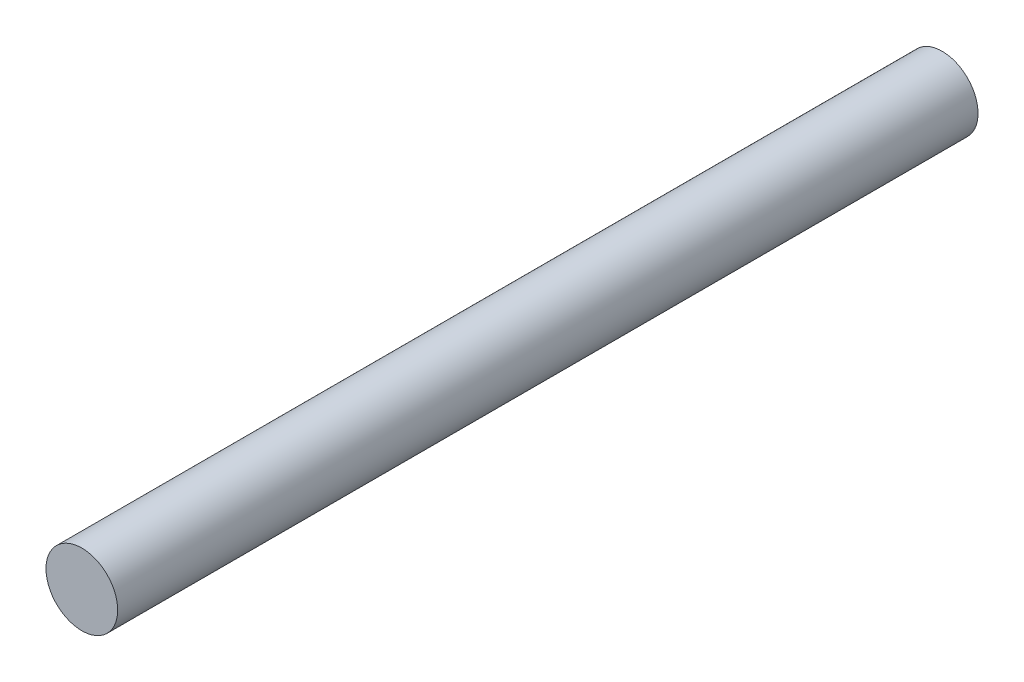
ISO-10303-21;
HEADER;
FILE_DESCRIPTION(('STEP AP214'),'2;1');
FILE_NAME('part.step','',(''),(''),'','','');
FILE_SCHEMA(('AUTOMOTIVE_DESIGN { 1 0 10303 214 1 1 1 1 }'));
ENDSEC;
DATA;
#1=APPLICATION_CONTEXT('core data for automotive mechanical design processes');
#2=APPLICATION_PROTOCOL_DEFINITION('international standard','automotive_design',2000,#1);
#3=PRODUCT_CONTEXT('',#1,'mechanical');
#4=PRODUCT('Part','Part','',(#3));
#5=PRODUCT_RELATED_PRODUCT_CATEGORY('part','',(#4));
#6=PRODUCT_DEFINITION_FORMATION('','',#4);
#7=PRODUCT_DEFINITION_CONTEXT('part definition',#1,'design');
#8=PRODUCT_DEFINITION('design','',#6,#7);
#9=PRODUCT_DEFINITION_SHAPE('','',#8);
#10=(LENGTH_UNIT() NAMED_UNIT(*) SI_UNIT(.MILLI.,.METRE.));
#11=(NAMED_UNIT(*) PLANE_ANGLE_UNIT() SI_UNIT($,.RADIAN.));
#12=(NAMED_UNIT(*) SI_UNIT($,.STERADIAN.) SOLID_ANGLE_UNIT());
#13=UNCERTAINTY_MEASURE_WITH_UNIT(LENGTH_MEASURE(1.E-05),#10,'distance_accuracy_value','');
#14=(GEOMETRIC_REPRESENTATION_CONTEXT(3) GLOBAL_UNCERTAINTY_ASSIGNED_CONTEXT((#13)) GLOBAL_UNIT_ASSIGNED_CONTEXT((#10,
#11,#12)) REPRESENTATION_CONTEXT('',''));
#15=CARTESIAN_POINT('',(0.,0.,0.));
#16=DIRECTION('',(0.,0.,1.));
#17=DIRECTION('',(1.,0.,0.));
#18=AXIS2_PLACEMENT_3D('',#15,#16,#17);
#19=CARTESIAN_POINT('',(0.,0.,304.8));
#20=DIRECTION('',(0.,0.,-1.));
#21=DIRECTION('',(-1.,0.,0.));
#22=AXIS2_PLACEMENT_3D('',#19,#20,#21);
#23=CYLINDRICAL_SURFACE('',#22,12.7);
#24=CARTESIAN_POINT('',(0.,0.,304.8));
#25=DIRECTION('',(0.,0.,1.));
#26=DIRECTION('',(1.,0.,0.));
#27=AXIS2_PLACEMENT_3D('',#24,#25,#26);
#28=CIRCLE('',#27,12.7);
#29=CARTESIAN_POINT('',(-12.7,0.,304.8));
#30=VERTEX_POINT('',#29);
#31=EDGE_CURVE('E10',#30,#30,#28,.T.);
#32=CARTESIAN_POINT('',(0.,0.,0.));
#33=DIRECTION('',(0.,0.,1.));
#34=DIRECTION('',(1.,0.,0.));
#35=AXIS2_PLACEMENT_3D('',#32,#33,#34);
#36=CIRCLE('',#35,12.7);
#37=CARTESIAN_POINT('',(-12.7,0.,0.));
#38=VERTEX_POINT('',#37);
#39=EDGE_CURVE('E42',#38,#38,#36,.T.);
#40=CARTESIAN_POINT('',(-12.7,0.,304.8));
#41=CARTESIAN_POINT('',(-12.7,0.,301.625));
#42=CARTESIAN_POINT('',(-12.7,0.,298.45));
#43=CARTESIAN_POINT('',(-12.7,0.,292.1));
#44=CARTESIAN_POINT('',(-12.7,0.,288.925));
#45=CARTESIAN_POINT('',(-12.7,0.,282.575));
#46=CARTESIAN_POINT('',(-12.7,0.,279.4));
#47=CARTESIAN_POINT('',(-12.7,0.,273.05));
#48=CARTESIAN_POINT('',(-12.7,0.,269.875));
#49=CARTESIAN_POINT('',(-12.7,0.,263.525));
#50=CARTESIAN_POINT('',(-12.7,0.,260.35));
#51=CARTESIAN_POINT('',(-12.7,0.,254.));
#52=CARTESIAN_POINT('',(-12.7,0.,250.825));
#53=CARTESIAN_POINT('',(-12.7,0.,244.475));
#54=CARTESIAN_POINT('',(-12.7,0.,241.3));
#55=CARTESIAN_POINT('',(-12.7,0.,234.95));
#56=CARTESIAN_POINT('',(-12.7,0.,231.775));
#57=CARTESIAN_POINT('',(-12.7,0.,225.425));
#58=CARTESIAN_POINT('',(-12.7,0.,222.25));
#59=CARTESIAN_POINT('',(-12.7,0.,215.9));
#60=CARTESIAN_POINT('',(-12.7,0.,212.725));
#61=CARTESIAN_POINT('',(-12.7,0.,206.375));
#62=CARTESIAN_POINT('',(-12.7,0.,203.2));
#63=CARTESIAN_POINT('',(-12.7,0.,196.85));
#64=CARTESIAN_POINT('',(-12.7,0.,193.675));
#65=CARTESIAN_POINT('',(-12.7,0.,187.325));
#66=CARTESIAN_POINT('',(-12.7,0.,184.15));
#67=CARTESIAN_POINT('',(-12.7,0.,177.8));
#68=CARTESIAN_POINT('',(-12.7,0.,174.625));
#69=CARTESIAN_POINT('',(-12.7,0.,168.275));
#70=CARTESIAN_POINT('',(-12.7,0.,165.1));
#71=CARTESIAN_POINT('',(-12.7,0.,158.75));
#72=CARTESIAN_POINT('',(-12.7,0.,155.575));
#73=CARTESIAN_POINT('',(-12.7,0.,149.225));
#74=CARTESIAN_POINT('',(-12.7,0.,146.05));
#75=CARTESIAN_POINT('',(-12.7,0.,139.7));
#76=CARTESIAN_POINT('',(-12.7,0.,136.525));
#77=CARTESIAN_POINT('',(-12.7,0.,130.175));
#78=CARTESIAN_POINT('',(-12.7,0.,127.));
#79=CARTESIAN_POINT('',(-12.7,0.,120.65));
#80=CARTESIAN_POINT('',(-12.7,0.,117.475));
#81=CARTESIAN_POINT('',(-12.7,0.,111.125));
#82=CARTESIAN_POINT('',(-12.7,0.,107.95));
#83=CARTESIAN_POINT('',(-12.7,0.,101.6));
#84=CARTESIAN_POINT('',(-12.7,0.,98.425));
#85=CARTESIAN_POINT('',(-12.7,0.,92.075));
#86=CARTESIAN_POINT('',(-12.7,0.,88.9));
#87=CARTESIAN_POINT('',(-12.7,0.,82.55));
#88=CARTESIAN_POINT('',(-12.7,0.,79.375));
#89=CARTESIAN_POINT('',(-12.7,0.,73.025));
#90=CARTESIAN_POINT('',(-12.7,0.,69.85));
#91=CARTESIAN_POINT('',(-12.7,0.,63.5));
#92=CARTESIAN_POINT('',(-12.7,0.,60.325));
#93=CARTESIAN_POINT('',(-12.7,0.,53.975));
#94=CARTESIAN_POINT('',(-12.7,0.,50.8));
#95=CARTESIAN_POINT('',(-12.7,0.,44.45));
#96=CARTESIAN_POINT('',(-12.7,0.,41.275));
#97=CARTESIAN_POINT('',(-12.7,0.,34.925));
#98=CARTESIAN_POINT('',(-12.7,0.,31.75));
#99=CARTESIAN_POINT('',(-12.7,0.,25.4));
#100=CARTESIAN_POINT('',(-12.7,0.,22.225));
#101=CARTESIAN_POINT('',(-12.7,0.,15.875));
#102=CARTESIAN_POINT('',(-12.7,0.,12.7));
#103=CARTESIAN_POINT('',(-12.7,0.,6.35));
#104=CARTESIAN_POINT('',(-12.7,0.,3.175));
#105=CARTESIAN_POINT('',(-12.7,0.,0.));
#106=B_SPLINE_CURVE_WITH_KNOTS('',3,(#40,#41,#42,#43,#44,#45,#46,#47,#48,#49,#50,#51,#52,#53,
#54,#55,#56,#57,#58,#59,#60,#61,#62,#63,#64,#65,#66,#67,#68,#69,#70,#71,#72,#73,#74,#75,#76,#77,
#78,#79,#80,#81,#82,#83,#84,#85,#86,#87,#88,#89,#90,#91,#92,#93,#94,#95,#96,#97,#98,#99,#100,
#101,#102,#103,#104,#105),.UNSPECIFIED.,.F.,.F.,(4,2,2,2,2,2,2,2,2,2,2,2,2,2,2,2,2,2,2,2,2,2,2,
2,2,2,2,2,2,2,2,2,4),(0.,9.52500000000001,19.05,28.575,38.1,47.625,57.15,66.675,76.2,
85.7250000000001,95.2500000000001,104.775,114.3,123.825,133.35,142.875,152.4,161.925,171.45,
180.975,190.5,200.025,209.55,219.075,228.6,238.125,247.65,257.175,266.7,276.225,285.75,295.275,
304.8),.UNSPECIFIED.);
#107=EDGE_CURVE('BSEAM39',#30,#38,#106,.T.);
#108=ORIENTED_EDGE('',*,*,#31,.F.);
#109=ORIENTED_EDGE('',*,*,#39,.T.);
#110=ORIENTED_EDGE('',*,*,#107,.T.);
#111=ORIENTED_EDGE('',*,*,#107,.F.);
#112=EDGE_LOOP('',(#108,#110,#109,#111));
#113=FACE_BOUND('',#112,.T.);
#114=ADVANCED_FACE('F39',(#113),#23,.T.);
#115=CARTESIAN_POINT('',(0.,0.,304.8));
#116=DIRECTION('',(0.,0.,1.));
#117=DIRECTION('',(1.,0.,0.));
#118=AXIS2_PLACEMENT_3D('',#115,#116,#117);
#119=PLANE('',#118);
#120=ORIENTED_EDGE('',*,*,#31,.T.);
#121=EDGE_LOOP('',(#120));
#122=FACE_BOUND('',#121,.T.);
#123=ADVANCED_FACE('F56',(#122),#119,.T.);
#124=CARTESIAN_POINT('',(0.,0.,0.));
#125=DIRECTION('',(0.,0.,1.));
#126=DIRECTION('',(1.,0.,0.));
#127=AXIS2_PLACEMENT_3D('',#124,#125,#126);
#128=PLANE('',#127);
#129=ORIENTED_EDGE('',*,*,#39,.F.);
#130=EDGE_LOOP('',(#129));
#131=FACE_BOUND('',#130,.T.);
#132=ADVANCED_FACE('F54',(#131),#128,.F.);
#133=CLOSED_SHELL('',(#114,#123,#132));
#134=MANIFOLD_SOLID_BREP('B2',#133);
#135=ADVANCED_BREP_SHAPE_REPRESENTATION('',(#18,#134),#14);
#136=SHAPE_DEFINITION_REPRESENTATION(#9,#135);
ENDSEC;
END-ISO-10303-21;
